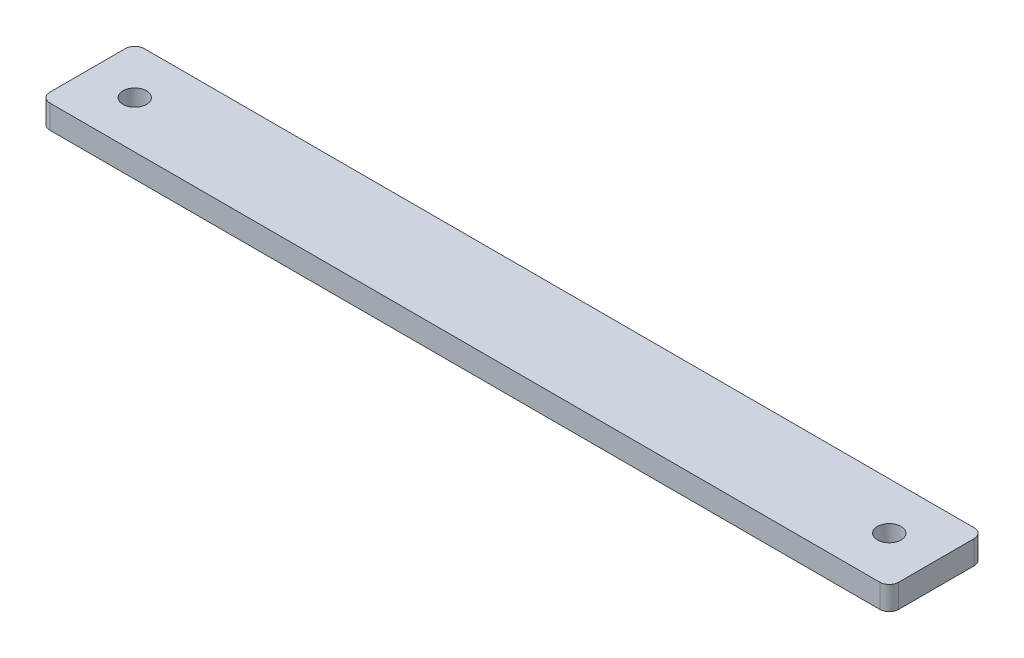
ISO-10303-21;
HEADER;
FILE_DESCRIPTION(('STEP AP214'),'2;1');
FILE_NAME('part.step','',(''),(''),'','','');
FILE_SCHEMA(('AUTOMOTIVE_DESIGN { 1 0 10303 214 1 1 1 1 }'));
ENDSEC;
DATA;
#1=APPLICATION_CONTEXT('core data for automotive mechanical design processes');
#2=APPLICATION_PROTOCOL_DEFINITION('international standard','automotive_design',2000,#1);
#3=PRODUCT_CONTEXT('',#1,'mechanical');
#4=PRODUCT('Part','Part','',(#3));
#5=PRODUCT_RELATED_PRODUCT_CATEGORY('part','',(#4));
#6=PRODUCT_DEFINITION_FORMATION('','',#4);
#7=PRODUCT_DEFINITION_CONTEXT('part definition',#1,'design');
#8=PRODUCT_DEFINITION('design','',#6,#7);
#9=PRODUCT_DEFINITION_SHAPE('','',#8);
#10=(LENGTH_UNIT() NAMED_UNIT(*) SI_UNIT(.MILLI.,.METRE.));
#11=(NAMED_UNIT(*) PLANE_ANGLE_UNIT() SI_UNIT($,.RADIAN.));
#12=(NAMED_UNIT(*) SI_UNIT($,.STERADIAN.) SOLID_ANGLE_UNIT());
#13=UNCERTAINTY_MEASURE_WITH_UNIT(LENGTH_MEASURE(1.E-05),#10,'distance_accuracy_value','');
#14=(GEOMETRIC_REPRESENTATION_CONTEXT(3) GLOBAL_UNCERTAINTY_ASSIGNED_CONTEXT((#13)) GLOBAL_UNIT_ASSIGNED_CONTEXT((#10,
#11,#12)) REPRESENTATION_CONTEXT('',''));
#15=CARTESIAN_POINT('',(0.,0.,0.));
#16=DIRECTION('',(0.,0.,1.));
#17=DIRECTION('',(1.,0.,0.));
#18=AXIS2_PLACEMENT_3D('',#15,#16,#17);
#19=CARTESIAN_POINT('',(0.,6.35,0.));
#20=DIRECTION('',(1.,0.,0.));
#21=DIRECTION('',(0.,0.,-1.));
#22=AXIS2_PLACEMENT_3D('',#19,#20,#21);
#23=PLANE('',#22);
#24=DIRECTION('',(0.,0.,1.));
#25=VECTOR('',#24,1.);
#26=CARTESIAN_POINT('',(0.,6.35,0.));
#27=LINE('',#26,#25);
#28=CARTESIAN_POINT('',(0.,6.35,-22.86));
#29=VERTEX_POINT('',#28);
#30=CARTESIAN_POINT('',(0.,6.35,-2.54));
#31=VERTEX_POINT('',#30);
#32=EDGE_CURVE('E129',#29,#31,#27,.T.);
#33=ORIENTED_EDGE('',*,*,#32,.F.);
#34=DIRECTION('',(0.,-1.,0.));
#35=VECTOR('',#34,1.);
#36=CARTESIAN_POINT('',(0.,6.35,-22.86));
#37=LINE('',#36,#35);
#38=CARTESIAN_POINT('',(0.,0.,-22.86));
#39=VERTEX_POINT('',#38);
#40=EDGE_CURVE('E11',#29,#39,#37,.T.);
#41=ORIENTED_EDGE('',*,*,#40,.T.);
#42=DIRECTION('',(0.,0.,1.));
#43=VECTOR('',#42,1.);
#44=CARTESIAN_POINT('',(0.,0.,0.));
#45=LINE('',#44,#43);
#46=CARTESIAN_POINT('',(0.,0.,-2.54));
#47=VERTEX_POINT('',#46);
#48=EDGE_CURVE('E131',#39,#47,#45,.T.);
#49=ORIENTED_EDGE('',*,*,#48,.T.);
#50=DIRECTION('',(0.,-1.,0.));
#51=VECTOR('',#50,1.);
#52=CARTESIAN_POINT('',(0.,6.35,-2.54));
#53=LINE('',#52,#51);
#54=EDGE_CURVE('E42',#47,#31,#53,.F.);
#55=ORIENTED_EDGE('',*,*,#54,.T.);
#56=EDGE_LOOP('',(#33,#41,#49,#55));
#57=FACE_BOUND('',#56,.T.);
#58=ADVANCED_FACE('F34',(#57),#23,.F.);
#59=CARTESIAN_POINT('',(0.,6.35,0.));
#60=DIRECTION('',(0.,0.,-1.));
#61=DIRECTION('',(-1.,0.,0.));
#62=AXIS2_PLACEMENT_3D('',#59,#60,#61);
#63=PLANE('',#62);
#64=DIRECTION('',(1.,0.,0.));
#65=VECTOR('',#64,1.);
#66=CARTESIAN_POINT('',(0.,0.,0.));
#67=LINE('',#66,#65);
#68=CARTESIAN_POINT('',(2.54,0.,0.));
#69=VERTEX_POINT('',#68);
#70=CARTESIAN_POINT('',(226.06,0.,0.));
#71=VERTEX_POINT('',#70);
#72=EDGE_CURVE('E127',#69,#71,#67,.T.);
#73=ORIENTED_EDGE('',*,*,#72,.T.);
#74=DIRECTION('',(0.,-1.,0.));
#75=VECTOR('',#74,1.);
#76=CARTESIAN_POINT('',(226.06,6.35,0.));
#77=LINE('',#76,#75);
#78=CARTESIAN_POINT('',(226.06,6.35,0.));
#79=VERTEX_POINT('',#78);
#80=EDGE_CURVE('E106',#71,#79,#77,.F.);
#81=ORIENTED_EDGE('',*,*,#80,.T.);
#82=DIRECTION('',(1.,0.,0.));
#83=VECTOR('',#82,1.);
#84=CARTESIAN_POINT('',(0.,6.35,0.));
#85=LINE('',#84,#83);
#86=CARTESIAN_POINT('',(2.54,6.35,0.));
#87=VERTEX_POINT('',#86);
#88=EDGE_CURVE('E167',#87,#79,#85,.T.);
#89=ORIENTED_EDGE('',*,*,#88,.F.);
#90=DIRECTION('',(0.,-1.,0.));
#91=VECTOR('',#90,1.);
#92=CARTESIAN_POINT('',(2.54,6.35,0.));
#93=LINE('',#92,#91);
#94=EDGE_CURVE('E111',#87,#69,#93,.T.);
#95=ORIENTED_EDGE('',*,*,#94,.T.);
#96=EDGE_LOOP('',(#73,#81,#89,#95));
#97=FACE_BOUND('',#96,.T.);
#98=ADVANCED_FACE('F171',(#97),#63,.F.);
#99=CARTESIAN_POINT('',(228.6,6.35,0.));
#100=DIRECTION('',(-1.,0.,0.));
#101=DIRECTION('',(0.,0.,1.));
#102=AXIS2_PLACEMENT_3D('',#99,#100,#101);
#103=PLANE('',#102);
#104=DIRECTION('',(0.,0.,-1.));
#105=VECTOR('',#104,1.);
#106=CARTESIAN_POINT('',(228.6,6.35,0.));
#107=LINE('',#106,#105);
#108=CARTESIAN_POINT('',(228.6,6.35,-2.54));
#109=VERTEX_POINT('',#108);
#110=CARTESIAN_POINT('',(228.6,6.35,-22.86));
#111=VERTEX_POINT('',#110);
#112=EDGE_CURVE('E120',#109,#111,#107,.T.);
#113=ORIENTED_EDGE('',*,*,#112,.F.);
#114=DIRECTION('',(0.,-1.,0.));
#115=VECTOR('',#114,1.);
#116=CARTESIAN_POINT('',(228.6,6.35,-2.54));
#117=LINE('',#116,#115);
#118=CARTESIAN_POINT('',(228.6,0.,-2.54));
#119=VERTEX_POINT('',#118);
#120=EDGE_CURVE('E105',#109,#119,#117,.T.);
#121=ORIENTED_EDGE('',*,*,#120,.T.);
#122=DIRECTION('',(0.,0.,-1.));
#123=VECTOR('',#122,1.);
#124=CARTESIAN_POINT('',(228.6,0.,0.));
#125=LINE('',#124,#123);
#126=CARTESIAN_POINT('',(228.6,0.,-22.86));
#127=VERTEX_POINT('',#126);
#128=EDGE_CURVE('E118',#119,#127,#125,.T.);
#129=ORIENTED_EDGE('',*,*,#128,.T.);
#130=DIRECTION('',(0.,-1.,0.));
#131=VECTOR('',#130,1.);
#132=CARTESIAN_POINT('',(228.6,6.35,-22.86));
#133=LINE('',#132,#131);
#134=EDGE_CURVE('E122',#127,#111,#133,.F.);
#135=ORIENTED_EDGE('',*,*,#134,.T.);
#136=EDGE_LOOP('',(#113,#121,#129,#135));
#137=FACE_BOUND('',#136,.T.);
#138=ADVANCED_FACE('F117',(#137),#103,.F.);
#139=CARTESIAN_POINT('',(0.,6.35,-25.4));
#140=DIRECTION('',(0.,0.,1.));
#141=DIRECTION('',(1.,0.,0.));
#142=AXIS2_PLACEMENT_3D('',#139,#140,#141);
#143=PLANE('',#142);
#144=DIRECTION('',(-1.,0.,0.));
#145=VECTOR('',#144,1.);
#146=CARTESIAN_POINT('',(0.,6.35,-25.4));
#147=LINE('',#146,#145);
#148=CARTESIAN_POINT('',(226.06,6.35,-25.4));
#149=VERTEX_POINT('',#148);
#150=CARTESIAN_POINT('',(2.54,6.35,-25.4));
#151=VERTEX_POINT('',#150);
#152=EDGE_CURVE('E135',#149,#151,#147,.T.);
#153=ORIENTED_EDGE('',*,*,#152,.F.);
#154=DIRECTION('',(0.,-1.,0.));
#155=VECTOR('',#154,1.);
#156=CARTESIAN_POINT('',(226.06,6.35,-25.4));
#157=LINE('',#156,#155);
#158=CARTESIAN_POINT('',(226.06,0.,-25.4));
#159=VERTEX_POINT('',#158);
#160=EDGE_CURVE('E152',#149,#159,#157,.T.);
#161=ORIENTED_EDGE('',*,*,#160,.T.);
#162=DIRECTION('',(-1.,0.,0.));
#163=VECTOR('',#162,1.);
#164=CARTESIAN_POINT('',(0.,0.,-25.4));
#165=LINE('',#164,#163);
#166=CARTESIAN_POINT('',(2.54,0.,-25.4));
#167=VERTEX_POINT('',#166);
#168=EDGE_CURVE('E126',#159,#167,#165,.T.);
#169=ORIENTED_EDGE('',*,*,#168,.T.);
#170=DIRECTION('',(0.,-1.,0.));
#171=VECTOR('',#170,1.);
#172=CARTESIAN_POINT('',(2.54,6.35,-25.4));
#173=LINE('',#172,#171);
#174=EDGE_CURVE('E49',#167,#151,#173,.F.);
#175=ORIENTED_EDGE('',*,*,#174,.T.);
#176=EDGE_LOOP('',(#153,#161,#169,#175));
#177=FACE_BOUND('',#176,.T.);
#178=ADVANCED_FACE('F200',(#177),#143,.F.);
#179=CARTESIAN_POINT('',(0.,6.35,0.));
#180=DIRECTION('',(0.,-1.,0.));
#181=DIRECTION('',(0.,0.,-1.));
#182=AXIS2_PLACEMENT_3D('',#179,#180,#181);
#183=PLANE('',#182);
#184=CARTESIAN_POINT('',(215.9,6.35,-12.7));
#185=DIRECTION('',(0.,-1.,0.));
#186=DIRECTION('',(0.,0.,-1.));
#187=AXIS2_PLACEMENT_3D('',#184,#185,#186);
#188=CIRCLE('',#187,3.175);
#189=CARTESIAN_POINT('',(215.9,6.35,-15.875));
#190=VERTEX_POINT('',#189);
#191=EDGE_CURVE('E182',#190,#190,#188,.T.);
#192=ORIENTED_EDGE('',*,*,#191,.T.);
#193=EDGE_LOOP('',(#192));
#194=FACE_BOUND('',#193,.T.);
#195=CARTESIAN_POINT('',(12.7,6.35,-12.7));
#196=DIRECTION('',(0.,-1.,0.));
#197=DIRECTION('',(0.,0.,-1.));
#198=AXIS2_PLACEMENT_3D('',#195,#196,#197);
#199=CIRCLE('',#198,3.175);
#200=CARTESIAN_POINT('',(12.7,6.35,-15.875));
#201=VERTEX_POINT('',#200);
#202=EDGE_CURVE('E172',#201,#201,#199,.T.);
#203=ORIENTED_EDGE('',*,*,#202,.T.);
#204=EDGE_LOOP('',(#203));
#205=FACE_BOUND('',#204,.T.);
#206=ORIENTED_EDGE('',*,*,#88,.T.);
#207=CARTESIAN_POINT('',(226.06,6.35,-2.54));
#208=DIRECTION('',(0.,-1.,0.));
#209=DIRECTION('',(0.,0.,-1.));
#210=AXIS2_PLACEMENT_3D('',#207,#208,#209);
#211=CIRCLE('',#210,2.54);
#212=EDGE_CURVE('E149',#79,#109,#211,.F.);
#213=ORIENTED_EDGE('',*,*,#212,.T.);
#214=ORIENTED_EDGE('',*,*,#112,.T.);
#215=CARTESIAN_POINT('',(226.06,6.35,-22.86));
#216=DIRECTION('',(0.,-1.,0.));
#217=DIRECTION('',(0.,0.,-1.));
#218=AXIS2_PLACEMENT_3D('',#215,#216,#217);
#219=CIRCLE('',#218,2.54);
#220=EDGE_CURVE('E56',#111,#149,#219,.F.);
#221=ORIENTED_EDGE('',*,*,#220,.T.);
#222=ORIENTED_EDGE('',*,*,#152,.T.);
#223=CARTESIAN_POINT('',(2.54,6.35,-22.86));
#224=DIRECTION('',(0.,-1.,0.));
#225=DIRECTION('',(0.,0.,-1.));
#226=AXIS2_PLACEMENT_3D('',#223,#224,#225);
#227=CIRCLE('',#226,2.54);
#228=EDGE_CURVE('E146',#151,#29,#227,.F.);
#229=ORIENTED_EDGE('',*,*,#228,.T.);
#230=ORIENTED_EDGE('',*,*,#32,.T.);
#231=CARTESIAN_POINT('',(2.54,6.35,-2.54));
#232=DIRECTION('',(0.,-1.,0.));
#233=DIRECTION('',(0.,0.,-1.));
#234=AXIS2_PLACEMENT_3D('',#231,#232,#233);
#235=CIRCLE('',#234,2.54);
#236=EDGE_CURVE('E144',#31,#87,#235,.F.);
#237=ORIENTED_EDGE('',*,*,#236,.T.);
#238=EDGE_LOOP('',(#206,#213,#214,#221,#222,#229,#230,#237));
#239=FACE_BOUND('',#238,.T.);
#240=ADVANCED_FACE('F164',(#194,#205,#239),#183,.F.);
#241=CARTESIAN_POINT('',(0.,0.,0.));
#242=DIRECTION('',(0.,-1.,0.));
#243=DIRECTION('',(0.,0.,-1.));
#244=AXIS2_PLACEMENT_3D('',#241,#242,#243);
#245=PLANE('',#244);
#246=CARTESIAN_POINT('',(215.9,0.,-12.7));
#247=DIRECTION('',(0.,1.,0.));
#248=DIRECTION('',(0.,0.,1.));
#249=AXIS2_PLACEMENT_3D('',#246,#247,#248);
#250=CIRCLE('',#249,3.175);
#251=CARTESIAN_POINT('',(215.9,0.,-9.52499999999997));
#252=VERTEX_POINT('',#251);
#253=EDGE_CURVE('E185',#252,#252,#250,.T.);
#254=ORIENTED_EDGE('',*,*,#253,.T.);
#255=EDGE_LOOP('',(#254));
#256=FACE_BOUND('',#255,.T.);
#257=CARTESIAN_POINT('',(12.7,0.,-12.7));
#258=DIRECTION('',(0.,1.,0.));
#259=DIRECTION('',(0.,0.,1.));
#260=AXIS2_PLACEMENT_3D('',#257,#258,#259);
#261=CIRCLE('',#260,3.175);
#262=CARTESIAN_POINT('',(12.7,0.,-9.52499999999995));
#263=VERTEX_POINT('',#262);
#264=EDGE_CURVE('E174',#263,#263,#261,.T.);
#265=ORIENTED_EDGE('',*,*,#264,.T.);
#266=EDGE_LOOP('',(#265));
#267=FACE_BOUND('',#266,.T.);
#268=ORIENTED_EDGE('',*,*,#128,.F.);
#269=CARTESIAN_POINT('',(226.06,0.,-2.54));
#270=DIRECTION('',(0.,-1.,0.));
#271=DIRECTION('',(0.,0.,-1.));
#272=AXIS2_PLACEMENT_3D('',#269,#270,#271);
#273=CIRCLE('',#272,2.54);
#274=EDGE_CURVE('E101',#119,#71,#273,.T.);
#275=ORIENTED_EDGE('',*,*,#274,.T.);
#276=ORIENTED_EDGE('',*,*,#72,.F.);
#277=CARTESIAN_POINT('',(2.54,0.,-2.54));
#278=DIRECTION('',(0.,-1.,0.));
#279=DIRECTION('',(0.,0.,-1.));
#280=AXIS2_PLACEMENT_3D('',#277,#278,#279);
#281=CIRCLE('',#280,2.54);
#282=EDGE_CURVE('E121',#69,#47,#281,.T.);
#283=ORIENTED_EDGE('',*,*,#282,.T.);
#284=ORIENTED_EDGE('',*,*,#48,.F.);
#285=CARTESIAN_POINT('',(2.54,0.,-22.86));
#286=DIRECTION('',(0.,-1.,0.));
#287=DIRECTION('',(0.,0.,-1.));
#288=AXIS2_PLACEMENT_3D('',#285,#286,#287);
#289=CIRCLE('',#288,2.54);
#290=EDGE_CURVE('E138',#39,#167,#289,.T.);
#291=ORIENTED_EDGE('',*,*,#290,.T.);
#292=ORIENTED_EDGE('',*,*,#168,.F.);
#293=CARTESIAN_POINT('',(226.06,0.,-22.86));
#294=DIRECTION('',(0.,-1.,0.));
#295=DIRECTION('',(0.,0.,-1.));
#296=AXIS2_PLACEMENT_3D('',#293,#294,#295);
#297=CIRCLE('',#296,2.54);
#298=EDGE_CURVE('E112',#159,#127,#297,.T.);
#299=ORIENTED_EDGE('',*,*,#298,.T.);
#300=EDGE_LOOP('',(#268,#275,#276,#283,#284,#291,#292,#299));
#301=FACE_BOUND('',#300,.T.);
#302=ADVANCED_FACE('F124',(#256,#267,#301),#245,.T.);
#303=CARTESIAN_POINT('',(12.7,0.,-12.7));
#304=DIRECTION('',(0.,1.,0.));
#305=DIRECTION('',(0.,0.,1.));
#306=AXIS2_PLACEMENT_3D('',#303,#304,#305);
#307=CYLINDRICAL_SURFACE('',#306,3.175);
#308=ORIENTED_EDGE('',*,*,#264,.F.);
#309=EDGE_LOOP('',(#308));
#310=FACE_BOUND('',#309,.T.);
#311=ORIENTED_EDGE('',*,*,#202,.F.);
#312=EDGE_LOOP('',(#311));
#313=FACE_BOUND('',#312,.T.);
#314=ADVANCED_FACE('F194',(#310,#313),#307,.F.);
#315=CARTESIAN_POINT('',(215.9,0.,-12.7));
#316=DIRECTION('',(0.,1.,0.));
#317=DIRECTION('',(0.,0.,1.));
#318=AXIS2_PLACEMENT_3D('',#315,#316,#317);
#319=CYLINDRICAL_SURFACE('',#318,3.175);
#320=ORIENTED_EDGE('',*,*,#253,.F.);
#321=EDGE_LOOP('',(#320));
#322=FACE_BOUND('',#321,.T.);
#323=ORIENTED_EDGE('',*,*,#191,.F.);
#324=EDGE_LOOP('',(#323));
#325=FACE_BOUND('',#324,.T.);
#326=ADVANCED_FACE('F191',(#322,#325),#319,.F.);
#327=CARTESIAN_POINT('',(226.06,6.35,-2.54));
#328=DIRECTION('',(0.,-1.,0.));
#329=DIRECTION('',(0.,0.,-1.));
#330=AXIS2_PLACEMENT_3D('',#327,#328,#329);
#331=CYLINDRICAL_SURFACE('',#330,2.54);
#332=ORIENTED_EDGE('',*,*,#212,.F.);
#333=ORIENTED_EDGE('',*,*,#80,.F.);
#334=ORIENTED_EDGE('',*,*,#274,.F.);
#335=ORIENTED_EDGE('',*,*,#120,.F.);
#336=EDGE_LOOP('',(#332,#333,#334,#335));
#337=FACE_BOUND('',#336,.T.);
#338=ADVANCED_FACE('F104',(#337),#331,.T.);
#339=CARTESIAN_POINT('',(226.06,6.35,-22.86));
#340=DIRECTION('',(0.,-1.,0.));
#341=DIRECTION('',(0.,0.,-1.));
#342=AXIS2_PLACEMENT_3D('',#339,#340,#341);
#343=CYLINDRICAL_SURFACE('',#342,2.54);
#344=ORIENTED_EDGE('',*,*,#220,.F.);
#345=ORIENTED_EDGE('',*,*,#134,.F.);
#346=ORIENTED_EDGE('',*,*,#298,.F.);
#347=ORIENTED_EDGE('',*,*,#160,.F.);
#348=EDGE_LOOP('',(#344,#345,#346,#347));
#349=FACE_BOUND('',#348,.T.);
#350=ADVANCED_FACE('F222',(#349),#343,.T.);
#351=CARTESIAN_POINT('',(2.54,6.35,-22.86));
#352=DIRECTION('',(0.,-1.,0.));
#353=DIRECTION('',(0.,0.,-1.));
#354=AXIS2_PLACEMENT_3D('',#351,#352,#353);
#355=CYLINDRICAL_SURFACE('',#354,2.54);
#356=ORIENTED_EDGE('',*,*,#228,.F.);
#357=ORIENTED_EDGE('',*,*,#174,.F.);
#358=ORIENTED_EDGE('',*,*,#290,.F.);
#359=ORIENTED_EDGE('',*,*,#40,.F.);
#360=EDGE_LOOP('',(#356,#357,#358,#359));
#361=FACE_BOUND('',#360,.T.);
#362=ADVANCED_FACE('F224',(#361),#355,.T.);
#363=CARTESIAN_POINT('',(2.54,6.35,-2.54));
#364=DIRECTION('',(0.,-1.,0.));
#365=DIRECTION('',(0.,0.,-1.));
#366=AXIS2_PLACEMENT_3D('',#363,#364,#365);
#367=CYLINDRICAL_SURFACE('',#366,2.54);
#368=ORIENTED_EDGE('',*,*,#236,.F.);
#369=ORIENTED_EDGE('',*,*,#54,.F.);
#370=ORIENTED_EDGE('',*,*,#282,.F.);
#371=ORIENTED_EDGE('',*,*,#94,.F.);
#372=EDGE_LOOP('',(#368,#369,#370,#371));
#373=FACE_BOUND('',#372,.T.);
#374=ADVANCED_FACE('F36',(#373),#367,.T.);
#375=CLOSED_SHELL('',(#58,#98,#138,#178,#240,#302,#314,#326,#338,#350,#362,#374));
#376=MANIFOLD_SOLID_BREP('B2',#375);
#377=ADVANCED_BREP_SHAPE_REPRESENTATION('',(#18,#376),#14);
#378=SHAPE_DEFINITION_REPRESENTATION(#9,#377);
ENDSEC;
END-ISO-10303-21;
